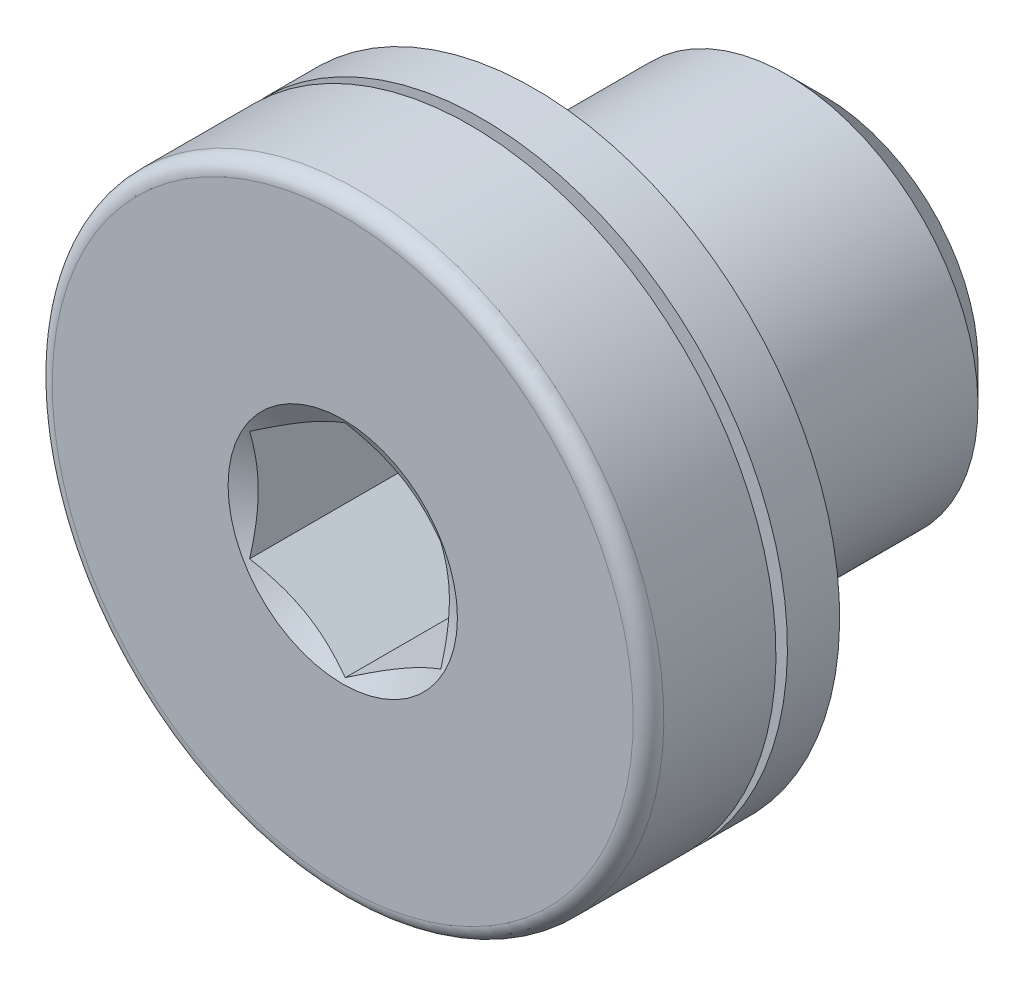
ISO-10303-21;
HEADER;
FILE_DESCRIPTION(('STEP AP214'),'2;1');
FILE_NAME('part.step','',(''),(''),'','','');
FILE_SCHEMA(('AUTOMOTIVE_DESIGN { 1 0 10303 214 1 1 1 1 }'));
ENDSEC;
DATA;
#1=APPLICATION_CONTEXT('core data for automotive mechanical design processes');
#2=APPLICATION_PROTOCOL_DEFINITION('international standard','automotive_design',2000,#1);
#3=PRODUCT_CONTEXT('',#1,'mechanical');
#4=PRODUCT('Part','Part','',(#3));
#5=PRODUCT_RELATED_PRODUCT_CATEGORY('part','',(#4));
#6=PRODUCT_DEFINITION_FORMATION('','',#4);
#7=PRODUCT_DEFINITION_CONTEXT('part definition',#1,'design');
#8=PRODUCT_DEFINITION('design','',#6,#7);
#9=PRODUCT_DEFINITION_SHAPE('','',#8);
#10=(LENGTH_UNIT() NAMED_UNIT(*) SI_UNIT(.MILLI.,.METRE.));
#11=(NAMED_UNIT(*) PLANE_ANGLE_UNIT() SI_UNIT($,.RADIAN.));
#12=(NAMED_UNIT(*) SI_UNIT($,.STERADIAN.) SOLID_ANGLE_UNIT());
#13=UNCERTAINTY_MEASURE_WITH_UNIT(LENGTH_MEASURE(1.E-05),#10,'distance_accuracy_value','');
#14=(GEOMETRIC_REPRESENTATION_CONTEXT(3) GLOBAL_UNCERTAINTY_ASSIGNED_CONTEXT((#13)) GLOBAL_UNIT_ASSIGNED_CONTEXT((#10,
#11,#12)) REPRESENTATION_CONTEXT('',''));
#15=CARTESIAN_POINT('',(0.,0.,0.));
#16=DIRECTION('',(0.,0.,1.));
#17=DIRECTION('',(1.,0.,0.));
#18=AXIS2_PLACEMENT_3D('',#15,#16,#17);
#19=CARTESIAN_POINT('',(0.,0.,2.5));
#20=DIRECTION('',(0.,0.,1.));
#21=DIRECTION('',(0.,-1.,0.));
#22=AXIS2_PLACEMENT_3D('',#19,#20,#21);
#23=CONICAL_SURFACE('',#22,1.5,1.04719755119662);
#24=CARTESIAN_POINT('',(0.0002,-1.44349114302794,2.46737460421494));
#25=CARTESIAN_POINT('',(-0.0547333052317653,-1.4117753844649,2.44905384431261));
#26=CARTESIAN_POINT('',(-0.11014078650024,-1.37978586023943,2.43239123574955));
#27=CARTESIAN_POINT('',(-0.221915367600341,-1.31525277575272,2.40330523349468));
#28=CARTESIAN_POINT('',(-0.278284454841711,-1.28270806805994,2.39089213152496));
#29=CARTESIAN_POINT('',(-0.390323974086986,-1.2180220214638,2.37156761718492));
#30=CARTESIAN_POINT('',(-0.445977158459231,-1.18589064048522,2.36452761899634));
#31=CARTESIAN_POINT('',(-0.557545653908394,-1.12147653960457,2.35612036217954));
#32=CARTESIAN_POINT('',(-0.613460558937603,-1.08919405413424,2.35474614475363));
#33=CARTESIAN_POINT('',(-0.717957921181728,-1.02886247391298,2.35759126691683));
#34=CARTESIAN_POINT('',(-0.766555949881318,-1.00080438896119,2.36111202836892));
#35=CARTESIAN_POINT('',(-0.86343536217324,-0.944871034195512,2.37227504224816));
#36=CARTESIAN_POINT('',(-0.911716410192165,-0.916995958125027,2.37992111512158));
#37=CARTESIAN_POINT('',(-1.00879588385404,-0.860947097873551,2.39903738424943));
#38=CARTESIAN_POINT('',(-1.0575820103519,-0.832780414607293,2.41058868652856));
#39=CARTESIAN_POINT('',(-1.1544262522921,-0.776867365453649,2.43680624424279));
#40=CARTESIAN_POINT('',(-1.20248561032696,-0.749120282155139,2.451466331688));
#41=CARTESIAN_POINT('',(-1.2502,-0.721572366433192,2.46737460421492));
#42=B_SPLINE_CURVE_WITH_KNOTS('',3,(#24,#25,#26,#27,#28,#29,#30,#31,#32,#33,#34,#35,#36,#37,#38,
#39,#40,#41),.UNSPECIFIED.,.F.,.F.,(4,2,2,2,2,2,2,2,4),(0.,0.198150821029563,0.396778196315228,
0.59048861735441,0.783961049317196,0.952480056398662,1.12115539730011,1.29357430343592,
1.46565426976932),.UNSPECIFIED.);
#43=CARTESIAN_POINT('',(0.,-1.4433756729741,2.46730792954892));
#44=VERTEX_POINT('',#43);
#45=CARTESIAN_POINT('',(-1.25,-0.72168783648703,2.4673079295489));
#46=VERTEX_POINT('',#45);
#47=EDGE_CURVE('E170',#44,#46,#42,.T.);
#48=ORIENTED_EDGE('',*,*,#47,.T.);
#49=CARTESIAN_POINT('',(-1.25,-1.87874572894168,2.93681578812608));
#50=CARTESIAN_POINT('',(-1.25,-1.82459913302068,2.91079630397452));
#51=CARTESIAN_POINT('',(-1.25,-1.77032166178898,2.88504443226517));
#52=CARTESIAN_POINT('',(-1.25,-1.66143478481926,2.83422768886452));
#53=CARTESIAN_POINT('',(-1.25,-1.60682532215901,2.80916293929029));
#54=CARTESIAN_POINT('',(-1.25,-1.49689322856349,2.75973307534326));
#55=CARTESIAN_POINT('',(-1.25,-1.44156828319314,2.73537308530055));
#56=CARTESIAN_POINT('',(-1.25,-1.33045744440503,2.68773477371074));
#57=CARTESIAN_POINT('',(-1.25,-1.27467157496949,2.66445639629877));
#58=CARTESIAN_POINT('',(-1.25,-1.16103991470961,2.61865938884855));
#59=CARTESIAN_POINT('',(-1.25,-1.10317898167126,2.59617783094599));
#60=CARTESIAN_POINT('',(-1.25,-0.986771125105983,2.55307334414044));
#61=CARTESIAN_POINT('',(-1.25,-0.928224116523322,2.5324506485031));
#62=CARTESIAN_POINT('',(-1.25,-0.751645593411336,2.47423400437964));
#63=CARTESIAN_POINT('',(-1.25,-0.632355580832299,2.44015611590166));
#64=CARTESIAN_POINT('',(-1.25,-0.451164738497959,2.40056175977571));
#65=CARTESIAN_POINT('',(-1.25,-0.390526459363068,2.3892961625641));
#66=CARTESIAN_POINT('',(-1.25,-0.268559609070197,2.37134572474735));
#67=CARTESIAN_POINT('',(-1.25,-0.207231087371657,2.36466055802818));
#68=CARTESIAN_POINT('',(-1.25,-0.0849660506850752,2.35648952204454));
#69=CARTESIAN_POINT('',(-1.25,-0.0240337887366337,2.35494164073779));
#70=CARTESIAN_POINT('',(-1.25,0.0977411791636485,2.35701041163861));
#71=CARTESIAN_POINT('',(-1.25,0.158583879563683,2.36062737154196));
#72=CARTESIAN_POINT('',(-1.25,0.308250226749134,2.37555891687979));
#73=CARTESIAN_POINT('',(-1.25,0.396792908586709,2.38969120089228));
#74=CARTESIAN_POINT('',(-1.25,0.572169530827059,2.42625541428785));
#75=CARTESIAN_POINT('',(-1.25,0.659001296563989,2.44869726858717));
#76=CARTESIAN_POINT('',(-1.25,0.788874180686677,2.48708761722013));
#77=CARTESIAN_POINT('',(-1.25,0.832585616783457,2.50085255945313));
#78=CARTESIAN_POINT('',(-1.25,0.919553498508184,2.52966970299115));
#79=CARTESIAN_POINT('',(-1.25,0.962810208444101,2.5447211041039));
#80=CARTESIAN_POINT('',(-1.25,1.04892603992316,2.57589128206207));
#81=CARTESIAN_POINT('',(-1.25,1.091785229078,2.59200987345469));
#82=CARTESIAN_POINT('',(-1.25,1.17716476887543,2.62513864976078));
#83=CARTESIAN_POINT('',(-1.25,1.21968506130426,2.64214898420581));
#84=CARTESIAN_POINT('',(-1.25,1.32891773604273,2.68695476047892));
#85=CARTESIAN_POINT('',(-1.25,1.39540440406977,2.71529990691633));
#86=CARTESIAN_POINT('',(-1.25,1.52776931254681,2.7733807400096));
#87=CARTESIAN_POINT('',(-1.25,1.59364750509837,2.80311653503706));
#88=CARTESIAN_POINT('',(-1.25,1.79057413329795,2.89391625928371));
#89=CARTESIAN_POINT('',(-1.25,1.92089140258712,2.95656271452606));
#90=CARTESIAN_POINT('',(-1.25,2.1804053543048,3.08450957970613));
#91=CARTESIAN_POINT('',(-1.25,2.30960041542491,3.14981323843585));
#92=CARTESIAN_POINT('',(-1.25,2.56709912603386,3.2821101646199));
#93=CARTESIAN_POINT('',(-1.25,2.69540289097166,3.34910320784087));
#94=CARTESIAN_POINT('',(-1.25,2.93915409594417,3.47778801998874));
#95=CARTESIAN_POINT('',(-1.25,3.05465756005898,3.53937404309921));
#96=CARTESIAN_POINT('',(-1.25,3.28529256409585,3.66324868838368));
#97=CARTESIAN_POINT('',(-1.25,3.40042408942658,3.72553733770159));
#98=CARTESIAN_POINT('',(-1.25,3.63010096677233,3.8504772588485));
#99=CARTESIAN_POINT('',(-1.25,3.7446470644513,3.91312716176761));
#100=CARTESIAN_POINT('',(-1.25,3.97350758740994,4.03883424336428));
#101=CARTESIAN_POINT('',(-1.25,4.08782202487979,4.10189139984006));
#102=CARTESIAN_POINT('',(-1.25,4.20205341997672,4.1650977292889));
#103=B_SPLINE_CURVE_WITH_KNOTS('',3,(#49,#50,#51,#52,#53,#54,#55,#56,#57,#58,#59,#60,#61,#62,
#63,#64,#65,#66,#67,#68,#69,#70,#71,#72,#73,#74,#75,#76,#77,#78,#79,#80,#81,#82,#83,#84,#85,#86,
#87,#88,#89,#90,#91,#92,#93,#94,#95,#96,#97,#98,#99,#100,#101,#102),.UNSPECIFIED.,.F.,.F.,(4,2,
2,2,2,2,2,2,2,2,2,2,2,2,2,2,2,2,2,2,2,2,2,2,2,2,4),(0.,0.180223813235836,0.360479451335505,
0.541820978833653,0.723153129678814,0.909344209300997,1.09555862131016,1.46694391400965,
1.65183212771015,1.83670717651117,2.01934232620658,2.2019883568583,2.4704270788046,
2.73918746255963,2.87665477201852,3.01403718896907,3.15139579440046,3.28877750688833,
3.50558451839347,3.7224084536589,4.15613189915053,4.59040257758367,5.02461591520003,
5.4173026103609,5.81000452814319,6.20168255127467,6.5933393990069),.UNSPECIFIED.);
#104=CARTESIAN_POINT('',(-1.25,0.72168783648703,2.4673079295489));
#105=VERTEX_POINT('',#104);
#106=EDGE_CURVE('E11',#46,#105,#103,.T.);
#107=ORIENTED_EDGE('',*,*,#106,.T.);
#108=CARTESIAN_POINT('',(-1.2502,0.721572366433192,2.46737460421492));
#109=CARTESIAN_POINT('',(-1.19526669476824,0.753288124996229,2.44905384431259));
#110=CARTESIAN_POINT('',(-1.13985921349976,0.785277649221703,2.43239123574953));
#111=CARTESIAN_POINT('',(-1.02808463239966,0.849810733708406,2.40330523349467));
#112=CARTESIAN_POINT('',(-0.971715545158294,0.882355441401186,2.39089213152495));
#113=CARTESIAN_POINT('',(-0.859676025913022,0.947041487997323,2.37156761718492));
#114=CARTESIAN_POINT('',(-0.804022841540778,0.9791728689759,2.36452761899634));
#115=CARTESIAN_POINT('',(-0.692454346091618,1.04358696985656,2.35612036217954));
#116=CARTESIAN_POINT('',(-0.63653944106241,1.07586945532688,2.35474614475363));
#117=CARTESIAN_POINT('',(-0.532042078818285,1.13620103554814,2.35759126691683));
#118=CARTESIAN_POINT('',(-0.483444050118694,1.16425912049993,2.36111202836893));
#119=CARTESIAN_POINT('',(-0.386564637826769,1.22019247526561,2.37227504224817));
#120=CARTESIAN_POINT('',(-0.338283589807843,1.2480675513361,2.37992111512159));
#121=CARTESIAN_POINT('',(-0.241204116145962,1.30411641158758,2.39903738424945));
#122=CARTESIAN_POINT('',(-0.192417989648104,1.33228309485383,2.41058868652857));
#123=CARTESIAN_POINT('',(-0.0955737477078999,1.38819614400748,2.43680624424281));
#124=CARTESIAN_POINT('',(-0.0475143896730369,1.41594322730599,2.45146633168802));
#125=CARTESIAN_POINT('',(0.000199999999999761,1.44349114302794,2.46737460421494));
#126=B_SPLINE_CURVE_WITH_KNOTS('',3,(#108,#109,#110,#111,#112,#113,#114,#115,#116,#117,#118,
#119,#120,#121,#122,#123,#124,#125),.UNSPECIFIED.,.F.,.F.,(4,2,2,2,2,2,2,2,4),(0.,
0.198150821029558,0.396778196315218,0.590488617354395,0.783961049317177,0.952480056398647,
1.1211553973001,1.29357430343591,1.46565426976932),.UNSPECIFIED.);
#127=CARTESIAN_POINT('',(0.,1.4433756729741,2.46730792954892));
#128=VERTEX_POINT('',#127);
#129=EDGE_CURVE('E50',#105,#128,#126,.T.);
#130=ORIENTED_EDGE('',*,*,#129,.T.);
#131=CARTESIAN_POINT('',(-0.0002,1.44349114302794,2.46737460421494));
#132=CARTESIAN_POINT('',(0.0547333052317653,1.4117753844649,2.44905384431261));
#133=CARTESIAN_POINT('',(0.11014078650024,1.37978586023943,2.43239123574955));
#134=CARTESIAN_POINT('',(0.221915367600341,1.31525277575272,2.40330523349468));
#135=CARTESIAN_POINT('',(0.278284454841711,1.28270806805994,2.39089213152496));
#136=CARTESIAN_POINT('',(0.390323974086986,1.2180220214638,2.37156761718492));
#137=CARTESIAN_POINT('',(0.445977158459231,1.18589064048522,2.36452761899634));
#138=CARTESIAN_POINT('',(0.557545653908394,1.12147653960457,2.35612036217954));
#139=CARTESIAN_POINT('',(0.613460558937603,1.08919405413424,2.35474614475363));
#140=CARTESIAN_POINT('',(0.717957921181727,1.02886247391298,2.35759126691683));
#141=CARTESIAN_POINT('',(0.766555949881318,1.00080438896119,2.36111202836892));
#142=CARTESIAN_POINT('',(0.86343536217324,0.944871034195512,2.37227504224816));
#143=CARTESIAN_POINT('',(0.911716410192165,0.916995958125027,2.37992111512158));
#144=CARTESIAN_POINT('',(1.00879588385404,0.860947097873551,2.39903738424943));
#145=CARTESIAN_POINT('',(1.0575820103519,0.832780414607293,2.41058868652856));
#146=CARTESIAN_POINT('',(1.1544262522921,0.776867365453649,2.43680624424279));
#147=CARTESIAN_POINT('',(1.20248561032696,0.749120282155139,2.451466331688));
#148=CARTESIAN_POINT('',(1.2502,0.721572366433192,2.46737460421492));
#149=B_SPLINE_CURVE_WITH_KNOTS('',3,(#131,#132,#133,#134,#135,#136,#137,#138,#139,#140,#141,
#142,#143,#144,#145,#146,#147,#148),.UNSPECIFIED.,.F.,.F.,(4,2,2,2,2,2,2,2,4),(0.,
0.198150821029563,0.396778196315228,0.59048861735441,0.783961049317196,0.952480056398661,
1.12115539730011,1.29357430343592,1.46565426976932),.UNSPECIFIED.);
#150=CARTESIAN_POINT('',(1.25,0.72168783648703,2.4673079295489));
#151=VERTEX_POINT('',#150);
#152=EDGE_CURVE('E280',#128,#151,#149,.T.);
#153=ORIENTED_EDGE('',*,*,#152,.T.);
#154=CARTESIAN_POINT('',(1.25,-1.87874572894168,2.93681578812608));
#155=CARTESIAN_POINT('',(1.25,-1.82459913302068,2.91079630397452));
#156=CARTESIAN_POINT('',(1.25,-1.77032166178898,2.88504443226517));
#157=CARTESIAN_POINT('',(1.25,-1.66143478481926,2.83422768886452));
#158=CARTESIAN_POINT('',(1.25,-1.60682532215901,2.80916293929029));
#159=CARTESIAN_POINT('',(1.25,-1.49689322856349,2.75973307534326));
#160=CARTESIAN_POINT('',(1.25,-1.44156828319314,2.73537308530055));
#161=CARTESIAN_POINT('',(1.25,-1.33045744440503,2.68773477371074));
#162=CARTESIAN_POINT('',(1.25,-1.27467157496949,2.66445639629877));
#163=CARTESIAN_POINT('',(1.25,-1.16103991470961,2.61865938884855));
#164=CARTESIAN_POINT('',(1.25,-1.10317898167126,2.59617783094599));
#165=CARTESIAN_POINT('',(1.25,-0.986771125105983,2.55307334414044));
#166=CARTESIAN_POINT('',(1.25,-0.928224116523322,2.5324506485031));
#167=CARTESIAN_POINT('',(1.25,-0.751645593411336,2.47423400437964));
#168=CARTESIAN_POINT('',(1.25,-0.632355580832299,2.44015611590166));
#169=CARTESIAN_POINT('',(1.25,-0.451164738497959,2.40056175977571));
#170=CARTESIAN_POINT('',(1.25,-0.390526459363068,2.3892961625641));
#171=CARTESIAN_POINT('',(1.25,-0.268559609070197,2.37134572474735));
#172=CARTESIAN_POINT('',(1.25,-0.207231087371657,2.36466055802818));
#173=CARTESIAN_POINT('',(1.25,-0.0849660506850752,2.35648952204454));
#174=CARTESIAN_POINT('',(1.25,-0.0240337887366337,2.35494164073779));
#175=CARTESIAN_POINT('',(1.25,0.0977411791636485,2.35701041163861));
#176=CARTESIAN_POINT('',(1.25,0.158583879563683,2.36062737154196));
#177=CARTESIAN_POINT('',(1.25,0.308250226749134,2.37555891687979));
#178=CARTESIAN_POINT('',(1.25,0.396792908586709,2.38969120089228));
#179=CARTESIAN_POINT('',(1.25,0.572169530827059,2.42625541428785));
#180=CARTESIAN_POINT('',(1.25,0.659001296563989,2.44869726858717));
#181=CARTESIAN_POINT('',(1.25,0.788874180686677,2.48708761722013));
#182=CARTESIAN_POINT('',(1.25,0.832585616783457,2.50085255945313));
#183=CARTESIAN_POINT('',(1.25,0.919553498508184,2.52966970299115));
#184=CARTESIAN_POINT('',(1.25,0.962810208444101,2.5447211041039));
#185=CARTESIAN_POINT('',(1.25,1.04892603992316,2.57589128206207));
#186=CARTESIAN_POINT('',(1.25,1.091785229078,2.59200987345469));
#187=CARTESIAN_POINT('',(1.25,1.17716476887543,2.62513864976078));
#188=CARTESIAN_POINT('',(1.25,1.21968506130426,2.64214898420581));
#189=CARTESIAN_POINT('',(1.25,1.32891773604273,2.68695476047892));
#190=CARTESIAN_POINT('',(1.25,1.39540440406977,2.71529990691633));
#191=CARTESIAN_POINT('',(1.25,1.52776931254681,2.7733807400096));
#192=CARTESIAN_POINT('',(1.25,1.59364750509837,2.80311653503706));
#193=CARTESIAN_POINT('',(1.25,1.79057413329795,2.89391625928371));
#194=CARTESIAN_POINT('',(1.25,1.92089140258712,2.95656271452606));
#195=CARTESIAN_POINT('',(1.25,2.1804053543048,3.08450957970613));
#196=CARTESIAN_POINT('',(1.25,2.30960041542491,3.14981323843585));
#197=CARTESIAN_POINT('',(1.25,2.56709912603386,3.2821101646199));
#198=CARTESIAN_POINT('',(1.25,2.69540289097166,3.34910320784087));
#199=CARTESIAN_POINT('',(1.25,2.93915409594417,3.47778801998874));
#200=CARTESIAN_POINT('',(1.25,3.05465756005898,3.53937404309921));
#201=CARTESIAN_POINT('',(1.25,3.28529256409585,3.66324868838368));
#202=CARTESIAN_POINT('',(1.25,3.40042408942658,3.72553733770159));
#203=CARTESIAN_POINT('',(1.25,3.63010096677233,3.8504772588485));
#204=CARTESIAN_POINT('',(1.25,3.7446470644513,3.91312716176761));
#205=CARTESIAN_POINT('',(1.25,3.97350758740994,4.03883424336428));
#206=CARTESIAN_POINT('',(1.25,4.08782202487979,4.10189139984006));
#207=CARTESIAN_POINT('',(1.25,4.20205341997672,4.1650977292889));
#208=B_SPLINE_CURVE_WITH_KNOTS('',3,(#154,#155,#156,#157,#158,#159,#160,#161,#162,#163,#164,
#165,#166,#167,#168,#169,#170,#171,#172,#173,#174,#175,#176,#177,#178,#179,#180,#181,#182,#183,
#184,#185,#186,#187,#188,#189,#190,#191,#192,#193,#194,#195,#196,#197,#198,#199,#200,#201,#202,
#203,#204,#205,#206,#207),.UNSPECIFIED.,.F.,.F.,(4,2,2,2,2,2,2,2,2,2,2,2,2,2,2,2,2,2,2,2,2,2,2,
2,2,2,4),(0.,0.180223813235836,0.360479451335505,0.541820978833653,0.723153129678814,
0.909344209300997,1.09555862131016,1.46694391400965,1.65183212771015,1.83670717651117,
2.01934232620658,2.2019883568583,2.4704270788046,2.73918746255963,2.87665477201852,
3.01403718896907,3.15139579440046,3.28877750688833,3.50558451839347,3.7224084536589,
4.15613189915053,4.59040257758367,5.02461591520003,5.4173026103609,5.81000452814319,
6.20168255127467,6.5933393990069),.UNSPECIFIED.);
#209=CARTESIAN_POINT('',(1.25,-0.72168783648703,2.4673079295489));
#210=VERTEX_POINT('',#209);
#211=EDGE_CURVE('E276',#151,#210,#208,.F.);
#212=ORIENTED_EDGE('',*,*,#211,.T.);
#213=CARTESIAN_POINT('',(1.2502,-0.721572366433192,2.46737460421492));
#214=CARTESIAN_POINT('',(1.19526669476824,-0.753288124996229,2.44905384431259));
#215=CARTESIAN_POINT('',(1.13985921349976,-0.785277649221703,2.43239123574954));
#216=CARTESIAN_POINT('',(1.02808463239966,-0.849810733708406,2.40330523349467));
#217=CARTESIAN_POINT('',(0.971715545158294,-0.882355441401186,2.39089213152495));
#218=CARTESIAN_POINT('',(0.859676025913022,-0.947041487997323,2.37156761718492));
#219=CARTESIAN_POINT('',(0.804022841540778,-0.9791728689759,2.36452761899634));
#220=CARTESIAN_POINT('',(0.692454346091618,-1.04358696985656,2.35612036217954));
#221=CARTESIAN_POINT('',(0.63653944106241,-1.07586945532688,2.35474614475363));
#222=CARTESIAN_POINT('',(0.532042078818285,-1.13620103554814,2.35759126691683));
#223=CARTESIAN_POINT('',(0.483444050118694,-1.16425912049993,2.36111202836893));
#224=CARTESIAN_POINT('',(0.386564637826769,-1.22019247526561,2.37227504224817));
#225=CARTESIAN_POINT('',(0.338283589807843,-1.2480675513361,2.37992111512159));
#226=CARTESIAN_POINT('',(0.241204116145961,-1.30411641158758,2.39903738424945));
#227=CARTESIAN_POINT('',(0.192417989648104,-1.33228309485383,2.41058868652857));
#228=CARTESIAN_POINT('',(0.0955737477078998,-1.38819614400748,2.43680624424281));
#229=CARTESIAN_POINT('',(0.0475143896730367,-1.41594322730599,2.45146633168802));
#230=CARTESIAN_POINT('',(-0.000199999999999973,-1.44349114302794,2.46737460421494));
#231=B_SPLINE_CURVE_WITH_KNOTS('',3,(#213,#214,#215,#216,#217,#218,#219,#220,#221,#222,#223,
#224,#225,#226,#227,#228,#229,#230),.UNSPECIFIED.,.F.,.F.,(4,2,2,2,2,2,2,2,4),(0.,
0.198150821029558,0.396778196315218,0.590488617354396,0.783961049317177,0.952480056398647,
1.1211553973001,1.29357430343591,1.46565426976932),.UNSPECIFIED.);
#232=EDGE_CURVE('E177',#210,#44,#231,.T.);
#233=ORIENTED_EDGE('',*,*,#232,.T.);
#234=EDGE_LOOP('',(#48,#107,#130,#153,#212,#233));
#235=FACE_BOUND('',#234,.T.);
#236=CARTESIAN_POINT('',(0.,0.,2.5));
#237=DIRECTION('',(0.,0.,1.));
#238=DIRECTION('',(0.,-1.,0.));
#239=AXIS2_PLACEMENT_3D('',#236,#237,#238);
#240=CIRCLE('',#239,1.5);
#241=CARTESIAN_POINT('',(0.,-1.5,2.5));
#242=VERTEX_POINT('',#241);
#243=EDGE_CURVE('E167',#242,#242,#240,.T.);
#244=ORIENTED_EDGE('',*,*,#243,.T.);
#245=EDGE_LOOP('',(#244));
#246=FACE_BOUND('',#245,.T.);
#247=ADVANCED_FACE('F37',(#235,#246),#23,.F.);
#248=CARTESIAN_POINT('',(0.,1.5,2.5));
#249=DIRECTION('',(0.,0.,-1.));
#250=DIRECTION('',(0.,1.,0.));
#251=AXIS2_PLACEMENT_3D('',#248,#249,#250);
#252=PLANE('',#251);
#253=ORIENTED_EDGE('',*,*,#243,.F.);
#254=EDGE_LOOP('',(#253));
#255=FACE_BOUND('',#254,.T.);
#256=CARTESIAN_POINT('',(0.,0.,2.5));
#257=DIRECTION('',(0.,0.,1.));
#258=DIRECTION('',(0.,-1.,0.));
#259=AXIS2_PLACEMENT_3D('',#256,#257,#258);
#260=CIRCLE('',#259,3.8);
#261=CARTESIAN_POINT('',(0.,-3.8,2.5));
#262=VERTEX_POINT('',#261);
#263=EDGE_CURVE('E164',#262,#262,#260,.T.);
#264=ORIENTED_EDGE('',*,*,#263,.T.);
#265=EDGE_LOOP('',(#264));
#266=FACE_BOUND('',#265,.T.);
#267=ADVANCED_FACE('F235',(#255,#266),#252,.F.);
#268=CARTESIAN_POINT('',(0.,0.,2.29999999999997));
#269=DIRECTION('',(0.,0.,1.));
#270=DIRECTION('',(0.,-1.,0.));
#271=AXIS2_PLACEMENT_3D('',#268,#269,#270);
#272=TOROIDAL_SURFACE('',#271,3.79999999999997,0.200000000000033);
#273=ORIENTED_EDGE('',*,*,#263,.F.);
#274=EDGE_LOOP('',(#273));
#275=FACE_BOUND('',#274,.T.);
#276=CARTESIAN_POINT('',(0.,0.,2.3));
#277=DIRECTION('',(0.,0.,1.));
#278=DIRECTION('',(0.,-1.,0.));
#279=AXIS2_PLACEMENT_3D('',#276,#277,#278);
#280=CIRCLE('',#279,4.);
#281=CARTESIAN_POINT('',(0.,-4.,2.3));
#282=VERTEX_POINT('',#281);
#283=EDGE_CURVE('E161',#282,#282,#280,.T.);
#284=ORIENTED_EDGE('',*,*,#283,.T.);
#285=EDGE_LOOP('',(#284));
#286=FACE_BOUND('',#285,.T.);
#287=ADVANCED_FACE('F232',(#275,#286),#272,.T.);
#288=CARTESIAN_POINT('',(0.,0.,-3.8));
#289=DIRECTION('',(0.,0.,1.));
#290=DIRECTION('',(0.,-1.,0.));
#291=AXIS2_PLACEMENT_3D('',#288,#289,#290);
#292=CYLINDRICAL_SURFACE('',#291,4.);
#293=ORIENTED_EDGE('',*,*,#283,.F.);
#294=EDGE_LOOP('',(#293));
#295=FACE_BOUND('',#294,.T.);
#296=CARTESIAN_POINT('',(0.,0.,0.83333333333333));
#297=DIRECTION('',(0.,0.,1.));
#298=DIRECTION('',(0.,-1.,0.));
#299=AXIS2_PLACEMENT_3D('',#296,#297,#298);
#300=CIRCLE('',#299,4.);
#301=CARTESIAN_POINT('',(0.,-4.,0.83333333333333));
#302=VERTEX_POINT('',#301);
#303=EDGE_CURVE('E158',#302,#302,#300,.T.);
#304=ORIENTED_EDGE('',*,*,#303,.T.);
#305=EDGE_LOOP('',(#304));
#306=FACE_BOUND('',#305,.T.);
#307=ADVANCED_FACE('F228',(#295,#306),#292,.T.);
#308=CARTESIAN_POINT('',(0.,4.,0.83333333333333));
#309=DIRECTION('',(0.,0.,1.));
#310=DIRECTION('',(0.,-1.,0.));
#311=AXIS2_PLACEMENT_3D('',#308,#309,#310);
#312=PLANE('',#311);
#313=ORIENTED_EDGE('',*,*,#303,.F.);
#314=EDGE_LOOP('',(#313));
#315=FACE_BOUND('',#314,.T.);
#316=CARTESIAN_POINT('',(0.,0.,0.83333333333333));
#317=DIRECTION('',(0.,0.,1.));
#318=DIRECTION('',(0.,-1.,0.));
#319=AXIS2_PLACEMENT_3D('',#316,#317,#318);
#320=CIRCLE('',#319,3.6);
#321=CARTESIAN_POINT('',(0.,-3.6,0.83333333333333));
#322=VERTEX_POINT('',#321);
#323=EDGE_CURVE('E155',#322,#322,#320,.T.);
#324=ORIENTED_EDGE('',*,*,#323,.T.);
#325=EDGE_LOOP('',(#324));
#326=FACE_BOUND('',#325,.T.);
#327=ADVANCED_FACE('F224',(#315,#326),#312,.F.);
#328=CARTESIAN_POINT('',(0.,0.,-3.8));
#329=DIRECTION('',(0.,0.,1.));
#330=DIRECTION('',(0.,-1.,0.));
#331=AXIS2_PLACEMENT_3D('',#328,#329,#330);
#332=CYLINDRICAL_SURFACE('',#331,3.6);
#333=ORIENTED_EDGE('',*,*,#323,.F.);
#334=EDGE_LOOP('',(#333));
#335=FACE_BOUND('',#334,.T.);
#336=CARTESIAN_POINT('',(0.,0.,0.68333333333333));
#337=DIRECTION('',(0.,0.,1.));
#338=DIRECTION('',(0.,-1.,0.));
#339=AXIS2_PLACEMENT_3D('',#336,#337,#338);
#340=CIRCLE('',#339,3.6);
#341=CARTESIAN_POINT('',(0.,-3.6,0.68333333333333));
#342=VERTEX_POINT('',#341);
#343=EDGE_CURVE('E152',#342,#342,#340,.T.);
#344=ORIENTED_EDGE('',*,*,#343,.T.);
#345=EDGE_LOOP('',(#344));
#346=FACE_BOUND('',#345,.T.);
#347=ADVANCED_FACE('F220',(#335,#346),#332,.T.);
#348=CARTESIAN_POINT('',(0.,3.6,0.68333333333333));
#349=DIRECTION('',(0.,0.,-1.));
#350=DIRECTION('',(0.,1.,0.));
#351=AXIS2_PLACEMENT_3D('',#348,#349,#350);
#352=PLANE('',#351);
#353=ORIENTED_EDGE('',*,*,#343,.F.);
#354=EDGE_LOOP('',(#353));
#355=FACE_BOUND('',#354,.T.);
#356=CARTESIAN_POINT('',(0.,0.,0.68333333333333));
#357=DIRECTION('',(0.,0.,1.));
#358=DIRECTION('',(0.,-1.,0.));
#359=AXIS2_PLACEMENT_3D('',#356,#357,#358);
#360=CIRCLE('',#359,4.);
#361=CARTESIAN_POINT('',(0.,-4.,0.68333333333333));
#362=VERTEX_POINT('',#361);
#363=EDGE_CURVE('E149',#362,#362,#360,.T.);
#364=ORIENTED_EDGE('',*,*,#363,.T.);
#365=EDGE_LOOP('',(#364));
#366=FACE_BOUND('',#365,.T.);
#367=ADVANCED_FACE('F216',(#355,#366),#352,.F.);
#368=CARTESIAN_POINT('',(0.,0.,-3.8));
#369=DIRECTION('',(0.,0.,1.));
#370=DIRECTION('',(0.,-1.,0.));
#371=AXIS2_PLACEMENT_3D('',#368,#369,#370);
#372=CYLINDRICAL_SURFACE('',#371,4.);
#373=ORIENTED_EDGE('',*,*,#363,.F.);
#374=EDGE_LOOP('',(#373));
#375=FACE_BOUND('',#374,.T.);
#376=CARTESIAN_POINT('',(0.,0.,0.));
#377=DIRECTION('',(0.,0.,1.));
#378=DIRECTION('',(0.,-1.,0.));
#379=AXIS2_PLACEMENT_3D('',#376,#377,#378);
#380=CIRCLE('',#379,4.);
#381=CARTESIAN_POINT('',(0.,-4.,0.));
#382=VERTEX_POINT('',#381);
#383=EDGE_CURVE('E146',#382,#382,#380,.T.);
#384=ORIENTED_EDGE('',*,*,#383,.T.);
#385=EDGE_LOOP('',(#384));
#386=FACE_BOUND('',#385,.T.);
#387=ADVANCED_FACE('F212',(#375,#386),#372,.T.);
#388=CARTESIAN_POINT('',(0.,4.,0.));
#389=DIRECTION('',(0.,0.,1.));
#390=DIRECTION('',(0.,-1.,0.));
#391=AXIS2_PLACEMENT_3D('',#388,#389,#390);
#392=PLANE('',#391);
#393=ORIENTED_EDGE('',*,*,#383,.F.);
#394=EDGE_LOOP('',(#393));
#395=FACE_BOUND('',#394,.T.);
#396=CARTESIAN_POINT('',(0.,0.,0.));
#397=DIRECTION('',(0.,0.,1.));
#398=DIRECTION('',(0.,-1.,0.));
#399=AXIS2_PLACEMENT_3D('',#396,#397,#398);
#400=CIRCLE('',#399,2.0095);
#401=CARTESIAN_POINT('',(0.,-2.0095,0.));
#402=VERTEX_POINT('',#401);
#403=EDGE_CURVE('E143',#402,#402,#400,.T.);
#404=ORIENTED_EDGE('',*,*,#403,.T.);
#405=EDGE_LOOP('',(#404));
#406=FACE_BOUND('',#405,.T.);
#407=ADVANCED_FACE('F208',(#395,#406),#392,.F.);
#408=CARTESIAN_POINT('',(0.,0.,-0.4905));
#409=DIRECTION('',(0.,0.,-1.));
#410=DIRECTION('',(0.,1.,0.));
#411=AXIS2_PLACEMENT_3D('',#408,#409,#410);
#412=CONICAL_SURFACE('',#411,2.5,0.785398163397448);
#413=ORIENTED_EDGE('',*,*,#403,.F.);
#414=EDGE_LOOP('',(#413));
#415=FACE_BOUND('',#414,.T.);
#416=CARTESIAN_POINT('',(0.,0.,-0.4905));
#417=DIRECTION('',(0.,0.,1.));
#418=DIRECTION('',(0.,-1.,0.));
#419=AXIS2_PLACEMENT_3D('',#416,#417,#418);
#420=CIRCLE('',#419,2.5);
#421=CARTESIAN_POINT('',(0.,-2.5,-0.4905));
#422=VERTEX_POINT('',#421);
#423=EDGE_CURVE('E140',#422,#422,#420,.T.);
#424=ORIENTED_EDGE('',*,*,#423,.T.);
#425=EDGE_LOOP('',(#424));
#426=FACE_BOUND('',#425,.T.);
#427=ADVANCED_FACE('F204',(#415,#426),#412,.T.);
#428=CARTESIAN_POINT('',(0.,0.,-3.8));
#429=DIRECTION('',(0.,0.,1.));
#430=DIRECTION('',(0.,-1.,0.));
#431=AXIS2_PLACEMENT_3D('',#428,#429,#430);
#432=CYLINDRICAL_SURFACE('',#431,2.5);
#433=ORIENTED_EDGE('',*,*,#423,.F.);
#434=EDGE_LOOP('',(#433));
#435=FACE_BOUND('',#434,.T.);
#436=CARTESIAN_POINT('',(0.,0.,-3.3095));
#437=DIRECTION('',(0.,0.,1.));
#438=DIRECTION('',(0.,-1.,0.));
#439=AXIS2_PLACEMENT_3D('',#436,#437,#438);
#440=CIRCLE('',#439,2.5);
#441=CARTESIAN_POINT('',(0.,-2.5,-3.3095));
#442=VERTEX_POINT('',#441);
#443=EDGE_CURVE('E137',#442,#442,#440,.T.);
#444=ORIENTED_EDGE('',*,*,#443,.T.);
#445=EDGE_LOOP('',(#444));
#446=FACE_BOUND('',#445,.T.);
#447=ADVANCED_FACE('F200',(#435,#446),#432,.T.);
#448=CARTESIAN_POINT('',(0.,0.,-3.8));
#449=DIRECTION('',(0.,0.,1.));
#450=DIRECTION('',(0.,-1.,0.));
#451=AXIS2_PLACEMENT_3D('',#448,#449,#450);
#452=CONICAL_SURFACE('',#451,2.0095,0.785398163397448);
#453=ORIENTED_EDGE('',*,*,#443,.F.);
#454=EDGE_LOOP('',(#453));
#455=FACE_BOUND('',#454,.T.);
#456=CARTESIAN_POINT('',(0.,0.,-3.8));
#457=DIRECTION('',(0.,0.,1.));
#458=DIRECTION('',(0.,-1.,0.));
#459=AXIS2_PLACEMENT_3D('',#456,#457,#458);
#460=CIRCLE('',#459,2.0095);
#461=CARTESIAN_POINT('',(0.,-2.0095,-3.8));
#462=VERTEX_POINT('',#461);
#463=EDGE_CURVE('E125',#462,#462,#460,.T.);
#464=ORIENTED_EDGE('',*,*,#463,.T.);
#465=EDGE_LOOP('',(#464));
#466=FACE_BOUND('',#465,.T.);
#467=ADVANCED_FACE('F196',(#455,#466),#452,.T.);
#468=CARTESIAN_POINT('',(0.,2.0095,-3.8));
#469=DIRECTION('',(0.,0.,1.));
#470=DIRECTION('',(0.,-1.,0.));
#471=AXIS2_PLACEMENT_3D('',#468,#469,#470);
#472=PLANE('',#471);
#473=ORIENTED_EDGE('',*,*,#463,.F.);
#474=EDGE_LOOP('',(#473));
#475=FACE_BOUND('',#474,.T.);
#476=ADVANCED_FACE('F193',(#475),#472,.F.);
#477=CARTESIAN_POINT('',(-1.25,0.72168783648703,0.));
#478=DIRECTION('',(-1.,0.,0.));
#479=DIRECTION('',(0.,0.,1.));
#480=AXIS2_PLACEMENT_3D('',#477,#478,#479);
#481=PLANE('',#480);
#482=DIRECTION('',(0.,0.,1.));
#483=VECTOR('',#482,1.);
#484=CARTESIAN_POINT('',(-1.25,-0.72168783648703,0.));
#485=LINE('',#484,#483);
#486=CARTESIAN_POINT('',(-1.25,-0.72168783648703,0.));
#487=VERTEX_POINT('',#486);
#488=EDGE_CURVE('E57',#487,#46,#485,.T.);
#489=ORIENTED_EDGE('',*,*,#488,.F.);
#490=DIRECTION('',(0.,-1.,0.));
#491=VECTOR('',#490,1.);
#492=CARTESIAN_POINT('',(-1.25,0.72168783648703,0.));
#493=LINE('',#492,#491);
#494=CARTESIAN_POINT('',(-1.25,0.72168783648703,0.));
#495=VERTEX_POINT('',#494);
#496=EDGE_CURVE('E96',#495,#487,#493,.T.);
#497=ORIENTED_EDGE('',*,*,#496,.F.);
#498=DIRECTION('',(0.,0.,1.));
#499=VECTOR('',#498,1.);
#500=CARTESIAN_POINT('',(-1.25,0.72168783648703,0.));
#501=LINE('',#500,#499);
#502=EDGE_CURVE('E123',#495,#105,#501,.T.);
#503=ORIENTED_EDGE('',*,*,#502,.T.);
#504=ORIENTED_EDGE('',*,*,#106,.F.);
#505=EDGE_LOOP('',(#489,#497,#503,#504));
#506=FACE_BOUND('',#505,.T.);
#507=ADVANCED_FACE('F94',(#506),#481,.F.);
#508=CARTESIAN_POINT('',(0.,1.4433756729741,0.));
#509=DIRECTION('',(-0.50000000000002,0.866025403784427,0.));
#510=DIRECTION('',(-0.866025403784427,-0.50000000000002,0.));
#511=AXIS2_PLACEMENT_3D('',#508,#509,#510);
#512=PLANE('',#511);
#513=ORIENTED_EDGE('',*,*,#502,.F.);
#514=DIRECTION('',(-0.866025403784427,-0.50000000000002,0.));
#515=VECTOR('',#514,1.);
#516=CARTESIAN_POINT('',(0.,1.4433756729741,0.));
#517=LINE('',#516,#515);
#518=CARTESIAN_POINT('',(0.,1.4433756729741,0.));
#519=VERTEX_POINT('',#518);
#520=EDGE_CURVE('E100',#519,#495,#517,.T.);
#521=ORIENTED_EDGE('',*,*,#520,.F.);
#522=DIRECTION('',(0.,0.,1.));
#523=VECTOR('',#522,1.);
#524=CARTESIAN_POINT('',(0.,1.4433756729741,0.));
#525=LINE('',#524,#523);
#526=EDGE_CURVE('E126',#519,#128,#525,.T.);
#527=ORIENTED_EDGE('',*,*,#526,.T.);
#528=ORIENTED_EDGE('',*,*,#129,.F.);
#529=EDGE_LOOP('',(#513,#521,#527,#528));
#530=FACE_BOUND('',#529,.T.);
#531=ADVANCED_FACE('F192',(#530),#512,.F.);
#532=CARTESIAN_POINT('',(1.25,0.72168783648703,0.));
#533=DIRECTION('',(0.50000000000002,0.866025403784427,0.));
#534=DIRECTION('',(-0.866025403784427,0.50000000000002,0.));
#535=AXIS2_PLACEMENT_3D('',#532,#533,#534);
#536=PLANE('',#535);
#537=ORIENTED_EDGE('',*,*,#526,.F.);
#538=DIRECTION('',(-0.866025403784427,0.50000000000002,0.));
#539=VECTOR('',#538,1.);
#540=CARTESIAN_POINT('',(1.25,0.72168783648703,0.));
#541=LINE('',#540,#539);
#542=CARTESIAN_POINT('',(1.25,0.72168783648703,0.));
#543=VERTEX_POINT('',#542);
#544=EDGE_CURVE('E120',#543,#519,#541,.T.);
#545=ORIENTED_EDGE('',*,*,#544,.F.);
#546=DIRECTION('',(0.,0.,1.));
#547=VECTOR('',#546,1.);
#548=CARTESIAN_POINT('',(1.25,0.72168783648703,0.));
#549=LINE('',#548,#547);
#550=EDGE_CURVE('E128',#543,#151,#549,.T.);
#551=ORIENTED_EDGE('',*,*,#550,.T.);
#552=ORIENTED_EDGE('',*,*,#152,.F.);
#553=EDGE_LOOP('',(#537,#545,#551,#552));
#554=FACE_BOUND('',#553,.T.);
#555=ADVANCED_FACE('F279',(#554),#536,.F.);
#556=CARTESIAN_POINT('',(1.25,-0.72168783648703,0.));
#557=DIRECTION('',(1.,0.,0.));
#558=DIRECTION('',(0.,0.,-1.));
#559=AXIS2_PLACEMENT_3D('',#556,#557,#558);
#560=PLANE('',#559);
#561=ORIENTED_EDGE('',*,*,#550,.F.);
#562=DIRECTION('',(0.,1.,0.));
#563=VECTOR('',#562,1.);
#564=CARTESIAN_POINT('',(1.25,-0.72168783648703,0.));
#565=LINE('',#564,#563);
#566=CARTESIAN_POINT('',(1.25,-0.72168783648703,0.));
#567=VERTEX_POINT('',#566);
#568=EDGE_CURVE('E117',#567,#543,#565,.T.);
#569=ORIENTED_EDGE('',*,*,#568,.F.);
#570=DIRECTION('',(0.,0.,1.));
#571=VECTOR('',#570,1.);
#572=CARTESIAN_POINT('',(1.25,-0.72168783648703,0.));
#573=LINE('',#572,#571);
#574=EDGE_CURVE('E131',#567,#210,#573,.T.);
#575=ORIENTED_EDGE('',*,*,#574,.T.);
#576=ORIENTED_EDGE('',*,*,#211,.F.);
#577=EDGE_LOOP('',(#561,#569,#575,#576));
#578=FACE_BOUND('',#577,.T.);
#579=ADVANCED_FACE('F275',(#578),#560,.F.);
#580=CARTESIAN_POINT('',(0.,-1.4433756729741,0.));
#581=DIRECTION('',(0.50000000000002,-0.866025403784427,0.));
#582=DIRECTION('',(0.866025403784427,0.50000000000002,0.));
#583=AXIS2_PLACEMENT_3D('',#580,#581,#582);
#584=PLANE('',#583);
#585=ORIENTED_EDGE('',*,*,#574,.F.);
#586=DIRECTION('',(0.866025403784427,0.50000000000002,0.));
#587=VECTOR('',#586,1.);
#588=CARTESIAN_POINT('',(0.,-1.4433756729741,0.));
#589=LINE('',#588,#587);
#590=CARTESIAN_POINT('',(0.,-1.4433756729741,0.));
#591=VERTEX_POINT('',#590);
#592=EDGE_CURVE('E109',#591,#567,#589,.T.);
#593=ORIENTED_EDGE('',*,*,#592,.F.);
#594=DIRECTION('',(0.,0.,1.));
#595=VECTOR('',#594,1.);
#596=CARTESIAN_POINT('',(0.,-1.4433756729741,0.));
#597=LINE('',#596,#595);
#598=EDGE_CURVE('E99',#591,#44,#597,.T.);
#599=ORIENTED_EDGE('',*,*,#598,.T.);
#600=ORIENTED_EDGE('',*,*,#232,.F.);
#601=EDGE_LOOP('',(#585,#593,#599,#600));
#602=FACE_BOUND('',#601,.T.);
#603=ADVANCED_FACE('F186',(#602),#584,.F.);
#604=CARTESIAN_POINT('',(-1.25,-0.72168783648703,0.));
#605=DIRECTION('',(-0.50000000000002,-0.866025403784427,0.));
#606=DIRECTION('',(0.866025403784427,-0.50000000000002,0.));
#607=AXIS2_PLACEMENT_3D('',#604,#605,#606);
#608=PLANE('',#607);
#609=ORIENTED_EDGE('',*,*,#598,.F.);
#610=DIRECTION('',(0.866025403784427,-0.50000000000002,0.));
#611=VECTOR('',#610,1.);
#612=CARTESIAN_POINT('',(-1.25,-0.72168783648703,0.));
#613=LINE('',#612,#611);
#614=EDGE_CURVE('E103',#487,#591,#613,.T.);
#615=ORIENTED_EDGE('',*,*,#614,.F.);
#616=ORIENTED_EDGE('',*,*,#488,.T.);
#617=ORIENTED_EDGE('',*,*,#47,.F.);
#618=EDGE_LOOP('',(#609,#615,#616,#617));
#619=FACE_BOUND('',#618,.T.);
#620=ADVANCED_FACE('F104',(#619),#608,.F.);
#621=CARTESIAN_POINT('',(0.,0.,0.));
#622=DIRECTION('',(0.,0.,1.));
#623=DIRECTION('',(1.,0.,0.));
#624=AXIS2_PLACEMENT_3D('',#621,#622,#623);
#625=PLANE('',#624);
#626=ORIENTED_EDGE('',*,*,#496,.T.);
#627=ORIENTED_EDGE('',*,*,#614,.T.);
#628=ORIENTED_EDGE('',*,*,#592,.T.);
#629=ORIENTED_EDGE('',*,*,#568,.T.);
#630=ORIENTED_EDGE('',*,*,#544,.T.);
#631=ORIENTED_EDGE('',*,*,#520,.T.);
#632=EDGE_LOOP('',(#626,#627,#628,#629,#630,#631));
#633=FACE_BOUND('',#632,.T.);
#634=ADVANCED_FACE('F111',(#633),#625,.T.);
#635=CLOSED_SHELL('',(#247,#267,#287,#307,#327,#347,#367,#387,#407,#427,#447,#467,#476,#507,
#531,#555,#579,#603,#620,#634));
#636=MANIFOLD_SOLID_BREP('B2',#635);
#637=ADVANCED_BREP_SHAPE_REPRESENTATION('',(#18,#636),#14);
#638=SHAPE_DEFINITION_REPRESENTATION(#9,#637);
ENDSEC;
END-ISO-10303-21;
